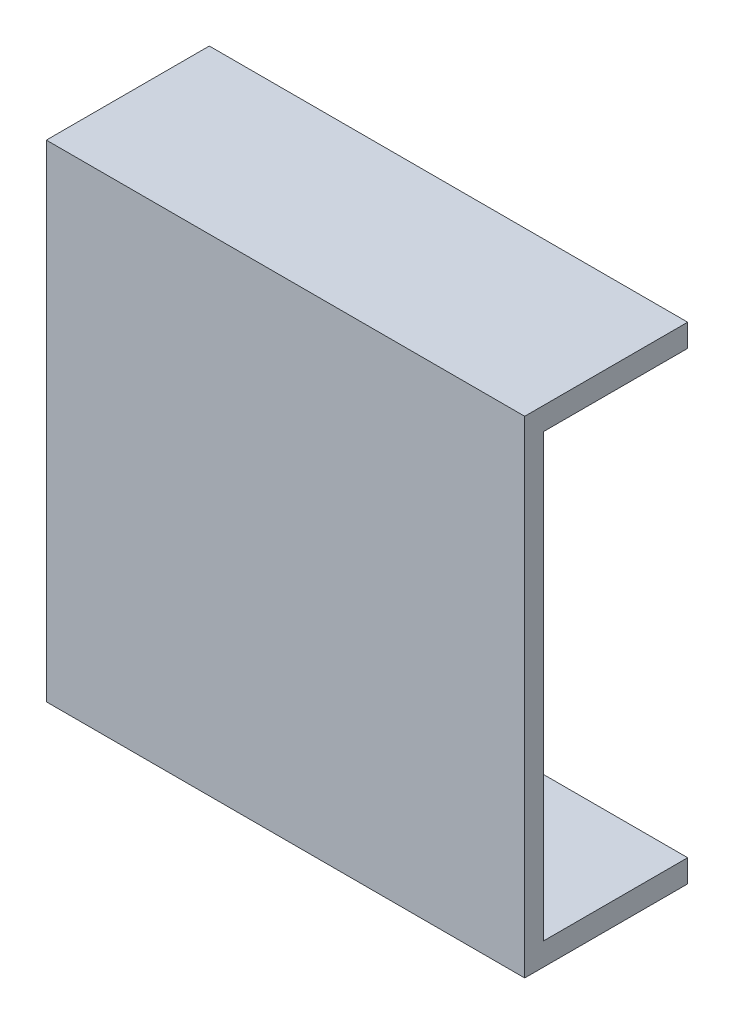
ISO-10303-21;
HEADER;
FILE_DESCRIPTION(('STEP AP214'),'2;1');
FILE_NAME('part.step','',(''),(''),'','','');
FILE_SCHEMA(('AUTOMOTIVE_DESIGN { 1 0 10303 214 1 1 1 1 }'));
ENDSEC;
DATA;
#1=APPLICATION_CONTEXT('core data for automotive mechanical design processes');
#2=APPLICATION_PROTOCOL_DEFINITION('international standard','automotive_design',2000,#1);
#3=PRODUCT_CONTEXT('',#1,'mechanical');
#4=PRODUCT('Part','Part','',(#3));
#5=PRODUCT_RELATED_PRODUCT_CATEGORY('part','',(#4));
#6=PRODUCT_DEFINITION_FORMATION('','',#4);
#7=PRODUCT_DEFINITION_CONTEXT('part definition',#1,'design');
#8=PRODUCT_DEFINITION('design','',#6,#7);
#9=PRODUCT_DEFINITION_SHAPE('','',#8);
#10=(LENGTH_UNIT() NAMED_UNIT(*) SI_UNIT(.MILLI.,.METRE.));
#11=(NAMED_UNIT(*) PLANE_ANGLE_UNIT() SI_UNIT($,.RADIAN.));
#12=(NAMED_UNIT(*) SI_UNIT($,.STERADIAN.) SOLID_ANGLE_UNIT());
#13=UNCERTAINTY_MEASURE_WITH_UNIT(LENGTH_MEASURE(1.E-05),#10,'distance_accuracy_value','');
#14=(GEOMETRIC_REPRESENTATION_CONTEXT(3) GLOBAL_UNCERTAINTY_ASSIGNED_CONTEXT((#13)) GLOBAL_UNIT_ASSIGNED_CONTEXT((#10,
#11,#12)) REPRESENTATION_CONTEXT('',''));
#15=CARTESIAN_POINT('',(0.,0.,0.));
#16=DIRECTION('',(0.,0.,1.));
#17=DIRECTION('',(1.,0.,0.));
#18=AXIS2_PLACEMENT_3D('',#15,#16,#17);
#19=CARTESIAN_POINT('',(-147.5,0.,0.));
#20=DIRECTION('',(0.,0.,1.));
#21=DIRECTION('',(1.,0.,0.));
#22=AXIS2_PLACEMENT_3D('',#19,#20,#21);
#23=PLANE('',#22);
#24=DIRECTION('',(1.,0.,0.));
#25=VECTOR('',#24,1.);
#26=CARTESIAN_POINT('',(147.5,14.,0.));
#27=LINE('',#26,#25);
#28=CARTESIAN_POINT('',(-147.5,14.,0.));
#29=VERTEX_POINT('',#28);
#30=CARTESIAN_POINT('',(147.5,14.,0.));
#31=VERTEX_POINT('',#30);
#32=EDGE_CURVE('E118',#29,#31,#27,.T.);
#33=ORIENTED_EDGE('',*,*,#32,.F.);
#34=DIRECTION('',(0.,-1.,0.));
#35=VECTOR('',#34,1.);
#36=CARTESIAN_POINT('',(-147.5,300.,0.));
#37=LINE('',#36,#35);
#38=CARTESIAN_POINT('',(-147.5,286.,0.));
#39=VERTEX_POINT('',#38);
#40=EDGE_CURVE('E148',#39,#29,#37,.T.);
#41=ORIENTED_EDGE('',*,*,#40,.F.);
#42=DIRECTION('',(-1.,0.,0.));
#43=VECTOR('',#42,1.);
#44=CARTESIAN_POINT('',(147.5,286.,0.));
#45=LINE('',#44,#43);
#46=CARTESIAN_POINT('',(147.5,286.,0.));
#47=VERTEX_POINT('',#46);
#48=EDGE_CURVE('E127',#47,#39,#45,.T.);
#49=ORIENTED_EDGE('',*,*,#48,.F.);
#50=DIRECTION('',(0.,1.,0.));
#51=VECTOR('',#50,1.);
#52=CARTESIAN_POINT('',(147.5,300.,0.));
#53=LINE('',#52,#51);
#54=EDGE_CURVE('E36',#31,#47,#53,.T.);
#55=ORIENTED_EDGE('',*,*,#54,.F.);
#56=EDGE_LOOP('',(#33,#41,#49,#55));
#57=FACE_BOUND('',#56,.T.);
#58=ADVANCED_FACE('F32',(#57),#23,.F.);
#59=CARTESIAN_POINT('',(-147.5,300.,11.5));
#60=DIRECTION('',(1.,0.,0.));
#61=DIRECTION('',(0.,0.,-1.));
#62=AXIS2_PLACEMENT_3D('',#59,#60,#61);
#63=PLANE('',#62);
#64=DIRECTION('',(0.,0.,-1.));
#65=VECTOR('',#64,1.);
#66=CARTESIAN_POINT('',(-147.5,300.,11.5));
#67=LINE('',#66,#65);
#68=CARTESIAN_POINT('',(-147.5,300.,11.5));
#69=VERTEX_POINT('',#68);
#70=CARTESIAN_POINT('',(-147.5,300.,-89.));
#71=VERTEX_POINT('',#70);
#72=EDGE_CURVE('E168',#69,#71,#67,.T.);
#73=ORIENTED_EDGE('',*,*,#72,.T.);
#74=DIRECTION('',(0.,1.,0.));
#75=VECTOR('',#74,1.);
#76=CARTESIAN_POINT('',(-147.5,300.,-89.));
#77=LINE('',#76,#75);
#78=CARTESIAN_POINT('',(-147.5,286.,-89.));
#79=VERTEX_POINT('',#78);
#80=EDGE_CURVE('E133',#79,#71,#77,.T.);
#81=ORIENTED_EDGE('',*,*,#80,.F.);
#82=DIRECTION('',(0.,0.,1.));
#83=VECTOR('',#82,1.);
#84=CARTESIAN_POINT('',(-147.5,286.,-89.));
#85=LINE('',#84,#83);
#86=EDGE_CURVE('E139',#79,#39,#85,.T.);
#87=ORIENTED_EDGE('',*,*,#86,.T.);
#88=ORIENTED_EDGE('',*,*,#40,.T.);
#89=DIRECTION('',(0.,0.,1.));
#90=VECTOR('',#89,1.);
#91=CARTESIAN_POINT('',(-147.5,14.,-89.));
#92=LINE('',#91,#90);
#93=CARTESIAN_POINT('',(-147.5,14.,-89.));
#94=VERTEX_POINT('',#93);
#95=EDGE_CURVE('E125',#94,#29,#92,.T.);
#96=ORIENTED_EDGE('',*,*,#95,.F.);
#97=DIRECTION('',(0.,1.,0.));
#98=VECTOR('',#97,1.);
#99=CARTESIAN_POINT('',(-147.5,0.,-89.));
#100=LINE('',#99,#98);
#101=CARTESIAN_POINT('',(-147.5,0.,-89.));
#102=VERTEX_POINT('',#101);
#103=EDGE_CURVE('E113',#102,#94,#100,.T.);
#104=ORIENTED_EDGE('',*,*,#103,.F.);
#105=DIRECTION('',(0.,0.,-1.));
#106=VECTOR('',#105,1.);
#107=CARTESIAN_POINT('',(-147.5,0.,11.5));
#108=LINE('',#107,#106);
#109=CARTESIAN_POINT('',(-147.5,0.,11.5));
#110=VERTEX_POINT('',#109);
#111=EDGE_CURVE('E11',#110,#102,#108,.T.);
#112=ORIENTED_EDGE('',*,*,#111,.F.);
#113=DIRECTION('',(0.,-1.,0.));
#114=VECTOR('',#113,1.);
#115=CARTESIAN_POINT('',(-147.5,300.,11.5));
#116=LINE('',#115,#114);
#117=EDGE_CURVE('E142',#69,#110,#116,.T.);
#118=ORIENTED_EDGE('',*,*,#117,.F.);
#119=EDGE_LOOP('',(#73,#81,#87,#88,#96,#104,#112,#118));
#120=FACE_BOUND('',#119,.T.);
#121=ADVANCED_FACE('F34',(#120),#63,.F.);
#122=CARTESIAN_POINT('',(-147.5,0.,11.5));
#123=DIRECTION('',(0.,1.,0.));
#124=DIRECTION('',(0.,0.,1.));
#125=AXIS2_PLACEMENT_3D('',#122,#123,#124);
#126=PLANE('',#125);
#127=ORIENTED_EDGE('',*,*,#111,.T.);
#128=DIRECTION('',(-1.,0.,0.));
#129=VECTOR('',#128,1.);
#130=CARTESIAN_POINT('',(147.5,0.,-89.));
#131=LINE('',#130,#129);
#132=CARTESIAN_POINT('',(147.5,0.,-89.));
#133=VERTEX_POINT('',#132);
#134=EDGE_CURVE('E108',#133,#102,#131,.T.);
#135=ORIENTED_EDGE('',*,*,#134,.F.);
#136=DIRECTION('',(0.,0.,-1.));
#137=VECTOR('',#136,1.);
#138=CARTESIAN_POINT('',(147.5,0.,11.5));
#139=LINE('',#138,#137);
#140=CARTESIAN_POINT('',(147.5,0.,11.5));
#141=VERTEX_POINT('',#140);
#142=EDGE_CURVE('E42',#141,#133,#139,.T.);
#143=ORIENTED_EDGE('',*,*,#142,.F.);
#144=DIRECTION('',(1.,0.,0.));
#145=VECTOR('',#144,1.);
#146=CARTESIAN_POINT('',(-147.5,0.,11.5));
#147=LINE('',#146,#145);
#148=EDGE_CURVE('E162',#110,#141,#147,.T.);
#149=ORIENTED_EDGE('',*,*,#148,.F.);
#150=EDGE_LOOP('',(#127,#135,#143,#149));
#151=FACE_BOUND('',#150,.T.);
#152=ADVANCED_FACE('F109',(#151),#126,.F.);
#153=CARTESIAN_POINT('',(147.5,300.,11.5));
#154=DIRECTION('',(-1.,0.,0.));
#155=DIRECTION('',(0.,0.,1.));
#156=AXIS2_PLACEMENT_3D('',#153,#154,#155);
#157=PLANE('',#156);
#158=ORIENTED_EDGE('',*,*,#142,.T.);
#159=DIRECTION('',(0.,-1.,0.));
#160=VECTOR('',#159,1.);
#161=CARTESIAN_POINT('',(147.5,0.,-89.));
#162=LINE('',#161,#160);
#163=CARTESIAN_POINT('',(147.5,14.,-89.));
#164=VERTEX_POINT('',#163);
#165=EDGE_CURVE('E101',#164,#133,#162,.T.);
#166=ORIENTED_EDGE('',*,*,#165,.F.);
#167=DIRECTION('',(0.,0.,1.));
#168=VECTOR('',#167,1.);
#169=CARTESIAN_POINT('',(147.5,14.,-89.));
#170=LINE('',#169,#168);
#171=EDGE_CURVE('E50',#164,#31,#170,.T.);
#172=ORIENTED_EDGE('',*,*,#171,.T.);
#173=ORIENTED_EDGE('',*,*,#54,.T.);
#174=DIRECTION('',(0.,0.,1.));
#175=VECTOR('',#174,1.);
#176=CARTESIAN_POINT('',(147.5,286.,-89.));
#177=LINE('',#176,#175);
#178=CARTESIAN_POINT('',(147.5,286.,-89.));
#179=VERTEX_POINT('',#178);
#180=EDGE_CURVE('E152',#179,#47,#177,.T.);
#181=ORIENTED_EDGE('',*,*,#180,.F.);
#182=DIRECTION('',(0.,-1.,0.));
#183=VECTOR('',#182,1.);
#184=CARTESIAN_POINT('',(147.5,300.,-89.));
#185=LINE('',#184,#183);
#186=CARTESIAN_POINT('',(147.5,300.,-89.));
#187=VERTEX_POINT('',#186);
#188=EDGE_CURVE('E128',#187,#179,#185,.T.);
#189=ORIENTED_EDGE('',*,*,#188,.F.);
#190=DIRECTION('',(0.,0.,-1.));
#191=VECTOR('',#190,1.);
#192=CARTESIAN_POINT('',(147.5,300.,11.5));
#193=LINE('',#192,#191);
#194=CARTESIAN_POINT('',(147.5,300.,11.5));
#195=VERTEX_POINT('',#194);
#196=EDGE_CURVE('E105',#195,#187,#193,.T.);
#197=ORIENTED_EDGE('',*,*,#196,.F.);
#198=DIRECTION('',(0.,1.,0.));
#199=VECTOR('',#198,1.);
#200=CARTESIAN_POINT('',(147.5,300.,11.5));
#201=LINE('',#200,#199);
#202=EDGE_CURVE('E103',#141,#195,#201,.T.);
#203=ORIENTED_EDGE('',*,*,#202,.F.);
#204=EDGE_LOOP('',(#158,#166,#172,#173,#181,#189,#197,#203));
#205=FACE_BOUND('',#204,.T.);
#206=ADVANCED_FACE('F99',(#205),#157,.F.);
#207=CARTESIAN_POINT('',(-147.5,300.,11.5));
#208=DIRECTION('',(0.,-1.,0.));
#209=DIRECTION('',(0.,0.,-1.));
#210=AXIS2_PLACEMENT_3D('',#207,#208,#209);
#211=PLANE('',#210);
#212=ORIENTED_EDGE('',*,*,#196,.T.);
#213=DIRECTION('',(1.,0.,0.));
#214=VECTOR('',#213,1.);
#215=CARTESIAN_POINT('',(147.5,300.,-89.));
#216=LINE('',#215,#214);
#217=EDGE_CURVE('E136',#71,#187,#216,.T.);
#218=ORIENTED_EDGE('',*,*,#217,.F.);
#219=ORIENTED_EDGE('',*,*,#72,.F.);
#220=DIRECTION('',(-1.,0.,0.));
#221=VECTOR('',#220,1.);
#222=CARTESIAN_POINT('',(-147.5,300.,11.5));
#223=LINE('',#222,#221);
#224=EDGE_CURVE('E165',#195,#69,#223,.T.);
#225=ORIENTED_EDGE('',*,*,#224,.F.);
#226=EDGE_LOOP('',(#212,#218,#219,#225));
#227=FACE_BOUND('',#226,.T.);
#228=ADVANCED_FACE('F176',(#227),#211,.F.);
#229=CARTESIAN_POINT('',(-147.5,0.,11.5));
#230=DIRECTION('',(0.,0.,1.));
#231=DIRECTION('',(1.,0.,0.));
#232=AXIS2_PLACEMENT_3D('',#229,#230,#231);
#233=PLANE('',#232);
#234=ORIENTED_EDGE('',*,*,#117,.T.);
#235=ORIENTED_EDGE('',*,*,#148,.T.);
#236=ORIENTED_EDGE('',*,*,#202,.T.);
#237=ORIENTED_EDGE('',*,*,#224,.T.);
#238=EDGE_LOOP('',(#234,#235,#236,#237));
#239=FACE_BOUND('',#238,.T.);
#240=ADVANCED_FACE('F189',(#239),#233,.T.);
#241=CARTESIAN_POINT('',(147.5,286.,-89.));
#242=DIRECTION('',(0.,1.,0.));
#243=DIRECTION('',(0.,0.,1.));
#244=AXIS2_PLACEMENT_3D('',#241,#242,#243);
#245=PLANE('',#244);
#246=ORIENTED_EDGE('',*,*,#48,.T.);
#247=ORIENTED_EDGE('',*,*,#86,.F.);
#248=DIRECTION('',(-1.,0.,0.));
#249=VECTOR('',#248,1.);
#250=CARTESIAN_POINT('',(147.5,286.,-89.));
#251=LINE('',#250,#249);
#252=EDGE_CURVE('E131',#179,#79,#251,.T.);
#253=ORIENTED_EDGE('',*,*,#252,.F.);
#254=ORIENTED_EDGE('',*,*,#180,.T.);
#255=EDGE_LOOP('',(#246,#247,#253,#254));
#256=FACE_BOUND('',#255,.T.);
#257=ADVANCED_FACE('F187',(#256),#245,.F.);
#258=CARTESIAN_POINT('',(147.5,286.,-89.));
#259=DIRECTION('',(0.,0.,-1.));
#260=DIRECTION('',(-1.,0.,0.));
#261=AXIS2_PLACEMENT_3D('',#258,#259,#260);
#262=PLANE('',#261);
#263=ORIENTED_EDGE('',*,*,#188,.T.);
#264=ORIENTED_EDGE('',*,*,#252,.T.);
#265=ORIENTED_EDGE('',*,*,#80,.T.);
#266=ORIENTED_EDGE('',*,*,#217,.T.);
#267=EDGE_LOOP('',(#263,#264,#265,#266));
#268=FACE_BOUND('',#267,.T.);
#269=ADVANCED_FACE('F180',(#268),#262,.T.);
#270=CARTESIAN_POINT('',(147.5,14.,-89.));
#271=DIRECTION('',(0.,-1.,0.));
#272=DIRECTION('',(1.,0.,0.));
#273=AXIS2_PLACEMENT_3D('',#270,#271,#272);
#274=PLANE('',#273);
#275=ORIENTED_EDGE('',*,*,#32,.T.);
#276=ORIENTED_EDGE('',*,*,#171,.F.);
#277=DIRECTION('',(1.,0.,0.));
#278=VECTOR('',#277,1.);
#279=CARTESIAN_POINT('',(147.5,14.,-89.));
#280=LINE('',#279,#278);
#281=EDGE_CURVE('E117',#94,#164,#280,.T.);
#282=ORIENTED_EDGE('',*,*,#281,.F.);
#283=ORIENTED_EDGE('',*,*,#95,.T.);
#284=EDGE_LOOP('',(#275,#276,#282,#283));
#285=FACE_BOUND('',#284,.T.);
#286=ADVANCED_FACE('F185',(#285),#274,.F.);
#287=CARTESIAN_POINT('',(147.5,0.,-89.));
#288=DIRECTION('',(0.,0.,1.));
#289=DIRECTION('',(1.,0.,0.));
#290=AXIS2_PLACEMENT_3D('',#287,#288,#289);
#291=PLANE('',#290);
#292=ORIENTED_EDGE('',*,*,#165,.T.);
#293=ORIENTED_EDGE('',*,*,#134,.T.);
#294=ORIENTED_EDGE('',*,*,#103,.T.);
#295=ORIENTED_EDGE('',*,*,#281,.T.);
#296=EDGE_LOOP('',(#292,#293,#294,#295));
#297=FACE_BOUND('',#296,.T.);
#298=ADVANCED_FACE('F115',(#297),#291,.F.);
#299=CLOSED_SHELL('',(#58,#121,#152,#206,#228,#240,#257,#269,#286,#298));
#300=MANIFOLD_SOLID_BREP('B2',#299);
#301=ADVANCED_BREP_SHAPE_REPRESENTATION('',(#18,#300),#14);
#302=SHAPE_DEFINITION_REPRESENTATION(#9,#301);
ENDSEC;
END-ISO-10303-21;
